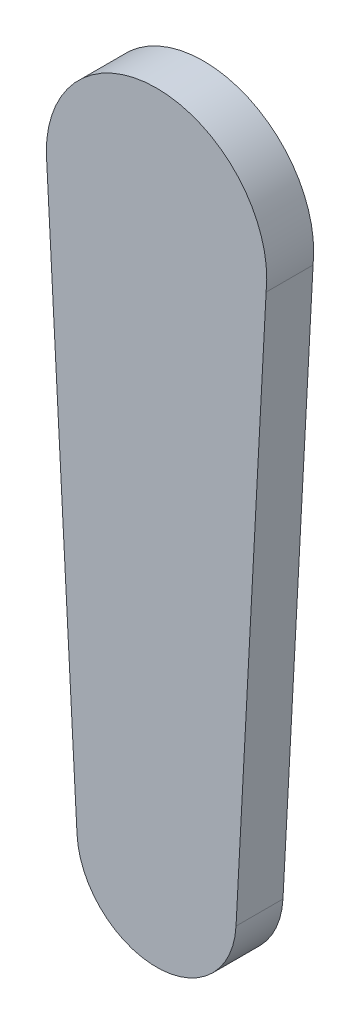
ISO-10303-21;
HEADER;
FILE_DESCRIPTION(('STEP AP214'),'2;1');
FILE_NAME('part.step','',(''),(''),'','','');
FILE_SCHEMA(('AUTOMOTIVE_DESIGN { 1 0 10303 214 1 1 1 1 }'));
ENDSEC;
DATA;
#1=APPLICATION_CONTEXT('core data for automotive mechanical design processes');
#2=APPLICATION_PROTOCOL_DEFINITION('international standard','automotive_design',2000,#1);
#3=PRODUCT_CONTEXT('',#1,'mechanical');
#4=PRODUCT('Part','Part','',(#3));
#5=PRODUCT_RELATED_PRODUCT_CATEGORY('part','',(#4));
#6=PRODUCT_DEFINITION_FORMATION('','',#4);
#7=PRODUCT_DEFINITION_CONTEXT('part definition',#1,'design');
#8=PRODUCT_DEFINITION('design','',#6,#7);
#9=PRODUCT_DEFINITION_SHAPE('','',#8);
#10=(LENGTH_UNIT() NAMED_UNIT(*) SI_UNIT(.MILLI.,.METRE.));
#11=(NAMED_UNIT(*) PLANE_ANGLE_UNIT() SI_UNIT($,.RADIAN.));
#12=(NAMED_UNIT(*) SI_UNIT($,.STERADIAN.) SOLID_ANGLE_UNIT());
#13=UNCERTAINTY_MEASURE_WITH_UNIT(LENGTH_MEASURE(1.E-05),#10,'distance_accuracy_value','');
#14=(GEOMETRIC_REPRESENTATION_CONTEXT(3) GLOBAL_UNCERTAINTY_ASSIGNED_CONTEXT((#13)) GLOBAL_UNIT_ASSIGNED_CONTEXT((#10,
#11,#12)) REPRESENTATION_CONTEXT('',''));
#15=CARTESIAN_POINT('',(0.,0.,0.));
#16=DIRECTION('',(0.,0.,1.));
#17=DIRECTION('',(1.,0.,0.));
#18=AXIS2_PLACEMENT_3D('',#15,#16,#17);
#19=CARTESIAN_POINT('',(0.,70.,11.5));
#20=DIRECTION('',(0.,0.,-1.));
#21=DIRECTION('',(-1.,0.,0.));
#22=AXIS2_PLACEMENT_3D('',#19,#20,#21);
#23=CYLINDRICAL_SURFACE('',#22,27.);
#24=CARTESIAN_POINT('',(0.,70.,11.5));
#25=DIRECTION('',(0.,0.,1.));
#26=DIRECTION('',(1.,0.,0.));
#27=AXIS2_PLACEMENT_3D('',#24,#25,#26);
#28=CIRCLE('',#27,27.);
#29=CARTESIAN_POINT('',(26.846607376126,67.1260354226023,11.5));
#30=VERTEX_POINT('',#29);
#31=CARTESIAN_POINT('',(-26.846607376126,67.1260354226024,11.5));
#32=VERTEX_POINT('',#31);
#33=EDGE_CURVE('E12',#30,#32,#28,.T.);
#34=ORIENTED_EDGE('',*,*,#33,.F.);
#35=DIRECTION('',(0.,0.,-1.));
#36=VECTOR('',#35,1.);
#37=CARTESIAN_POINT('',(26.846607376126,67.1260354226023,11.5));
#38=LINE('',#37,#36);
#39=CARTESIAN_POINT('',(26.846607376126,67.1260354226023,0.));
#40=VERTEX_POINT('',#39);
#41=EDGE_CURVE('E104',#30,#40,#38,.T.);
#42=ORIENTED_EDGE('',*,*,#41,.T.);
#43=CARTESIAN_POINT('',(0.,70.,0.));
#44=DIRECTION('',(0.,0.,1.));
#45=DIRECTION('',(1.,0.,0.));
#46=AXIS2_PLACEMENT_3D('',#43,#44,#45);
#47=CIRCLE('',#46,27.);
#48=CARTESIAN_POINT('',(-26.846607376126,67.1260354226024,0.));
#49=VERTEX_POINT('',#48);
#50=EDGE_CURVE('E59',#40,#49,#47,.T.);
#51=ORIENTED_EDGE('',*,*,#50,.T.);
#52=DIRECTION('',(0.,0.,-1.));
#53=VECTOR('',#52,1.);
#54=CARTESIAN_POINT('',(-26.846607376126,67.1260354226023,11.5));
#55=LINE('',#54,#53);
#56=EDGE_CURVE('E73',#32,#49,#55,.T.);
#57=ORIENTED_EDGE('',*,*,#56,.F.);
#58=EDGE_LOOP('',(#34,#42,#51,#57));
#59=FACE_BOUND('',#58,.T.);
#60=ADVANCED_FACE('F56',(#59),#23,.T.);
#61=CARTESIAN_POINT('',(0.,70.,11.5));
#62=DIRECTION('',(0.,0.,1.));
#63=DIRECTION('',(1.,0.,0.));
#64=AXIS2_PLACEMENT_3D('',#61,#62,#63);
#65=PLANE('',#64);
#66=ORIENTED_EDGE('',*,*,#33,.T.);
#67=DIRECTION('',(0.053297318373578,-0.998578687862997,0.));
#68=VECTOR('',#67,1.);
#69=CARTESIAN_POINT('',(-23.1977940506957,-1.23813999849179,11.5));
#70=LINE('',#69,#68);
#71=CARTESIAN_POINT('',(-19.4722844133284,-71.0392977082848,11.5));
#72=VERTEX_POINT('',#71);
#73=EDGE_CURVE('E111',#32,#72,#70,.T.);
#74=ORIENTED_EDGE('',*,*,#73,.T.);
#75=CARTESIAN_POINT('',(0.,-70.,11.5));
#76=DIRECTION('',(0.,0.,1.));
#77=DIRECTION('',(1.,0.,0.));
#78=AXIS2_PLACEMENT_3D('',#75,#76,#77);
#79=CIRCLE('',#78,19.5);
#80=CARTESIAN_POINT('',(19.4722844133284,-71.0392977082848,11.5));
#81=VERTEX_POINT('',#80);
#82=EDGE_CURVE('E96',#72,#81,#79,.T.);
#83=ORIENTED_EDGE('',*,*,#82,.T.);
#84=DIRECTION('',(-0.053297318373578,-0.998578687862997,0.));
#85=VECTOR('',#84,1.);
#86=CARTESIAN_POINT('',(23.1977940506957,-1.23813999849179,11.5));
#87=LINE('',#86,#85);
#88=EDGE_CURVE('E109',#30,#81,#87,.T.);
#89=ORIENTED_EDGE('',*,*,#88,.F.);
#90=EDGE_LOOP('',(#66,#74,#83,#89));
#91=FACE_BOUND('',#90,.T.);
#92=ADVANCED_FACE('F108',(#91),#65,.T.);
#93=CARTESIAN_POINT('',(0.,70.,0.));
#94=DIRECTION('',(0.,0.,1.));
#95=DIRECTION('',(1.,0.,0.));
#96=AXIS2_PLACEMENT_3D('',#93,#94,#95);
#97=PLANE('',#96);
#98=ORIENTED_EDGE('',*,*,#50,.F.);
#99=DIRECTION('',(-0.053297318373578,-0.998578687862997,0.));
#100=VECTOR('',#99,1.);
#101=CARTESIAN_POINT('',(23.1977940506957,-1.23813999849179,0.));
#102=LINE('',#101,#100);
#103=CARTESIAN_POINT('',(19.4722844133284,-71.0392977082848,0.));
#104=VERTEX_POINT('',#103);
#105=EDGE_CURVE('E112',#40,#104,#102,.T.);
#106=ORIENTED_EDGE('',*,*,#105,.T.);
#107=CARTESIAN_POINT('',(0.,-70.,0.));
#108=DIRECTION('',(0.,0.,1.));
#109=DIRECTION('',(1.,0.,0.));
#110=AXIS2_PLACEMENT_3D('',#107,#108,#109);
#111=CIRCLE('',#110,19.5);
#112=CARTESIAN_POINT('',(-19.4722844133284,-71.0392977082848,0.));
#113=VERTEX_POINT('',#112);
#114=EDGE_CURVE('E99',#113,#104,#111,.T.);
#115=ORIENTED_EDGE('',*,*,#114,.F.);
#116=DIRECTION('',(0.053297318373578,-0.998578687862997,0.));
#117=VECTOR('',#116,1.);
#118=CARTESIAN_POINT('',(-23.1977940506957,-1.23813999849179,0.));
#119=LINE('',#118,#117);
#120=EDGE_CURVE('E115',#49,#113,#119,.T.);
#121=ORIENTED_EDGE('',*,*,#120,.F.);
#122=EDGE_LOOP('',(#98,#106,#115,#121));
#123=FACE_BOUND('',#122,.T.);
#124=ADVANCED_FACE('F127',(#123),#97,.F.);
#125=CARTESIAN_POINT('',(23.1977940506957,-1.23813999849179,11.5));
#126=DIRECTION('',(0.998578687862997,-0.053297318373578,0.));
#127=DIRECTION('',(0.053297318373578,0.998578687862997,0.));
#128=AXIS2_PLACEMENT_3D('',#125,#126,#127);
#129=PLANE('',#128);
#130=ORIENTED_EDGE('',*,*,#105,.F.);
#131=ORIENTED_EDGE('',*,*,#41,.F.);
#132=ORIENTED_EDGE('',*,*,#88,.T.);
#133=DIRECTION('',(0.,0.,-1.));
#134=VECTOR('',#133,1.);
#135=CARTESIAN_POINT('',(19.4722844133284,-71.0392977082848,11.5));
#136=LINE('',#135,#134);
#137=EDGE_CURVE('E93',#81,#104,#136,.T.);
#138=ORIENTED_EDGE('',*,*,#137,.T.);
#139=EDGE_LOOP('',(#130,#131,#132,#138));
#140=FACE_BOUND('',#139,.T.);
#141=ADVANCED_FACE('F114',(#140),#129,.T.);
#142=CARTESIAN_POINT('',(-23.1977940506957,-1.23813999849179,11.5));
#143=DIRECTION('',(0.998578687862997,0.053297318373578,0.));
#144=DIRECTION('',(-0.053297318373578,0.998578687862997,0.));
#145=AXIS2_PLACEMENT_3D('',#142,#143,#144);
#146=PLANE('',#145);
#147=ORIENTED_EDGE('',*,*,#120,.T.);
#148=DIRECTION('',(0.,0.,-1.));
#149=VECTOR('',#148,1.);
#150=CARTESIAN_POINT('',(-19.4722844133284,-71.0392977082848,11.5));
#151=LINE('',#150,#149);
#152=EDGE_CURVE('E117',#72,#113,#151,.T.);
#153=ORIENTED_EDGE('',*,*,#152,.F.);
#154=ORIENTED_EDGE('',*,*,#73,.F.);
#155=ORIENTED_EDGE('',*,*,#56,.T.);
#156=EDGE_LOOP('',(#147,#153,#154,#155));
#157=FACE_BOUND('',#156,.T.);
#158=ADVANCED_FACE('F130',(#157),#146,.F.);
#159=CARTESIAN_POINT('',(0.,-70.,11.5));
#160=DIRECTION('',(0.,0.,-1.));
#161=DIRECTION('',(-1.,0.,0.));
#162=AXIS2_PLACEMENT_3D('',#159,#160,#161);
#163=CYLINDRICAL_SURFACE('',#162,19.5);
#164=ORIENTED_EDGE('',*,*,#114,.T.);
#165=ORIENTED_EDGE('',*,*,#137,.F.);
#166=ORIENTED_EDGE('',*,*,#82,.F.);
#167=ORIENTED_EDGE('',*,*,#152,.T.);
#168=EDGE_LOOP('',(#164,#165,#166,#167));
#169=FACE_BOUND('',#168,.T.);
#170=ADVANCED_FACE('F95',(#169),#163,.T.);
#171=CLOSED_SHELL('',(#60,#92,#124,#141,#158,#170));
#172=MANIFOLD_SOLID_BREP('B2',#171);
#173=ADVANCED_BREP_SHAPE_REPRESENTATION('',(#18,#172),#14);
#174=SHAPE_DEFINITION_REPRESENTATION(#9,#173);
ENDSEC;
END-ISO-10303-21;
